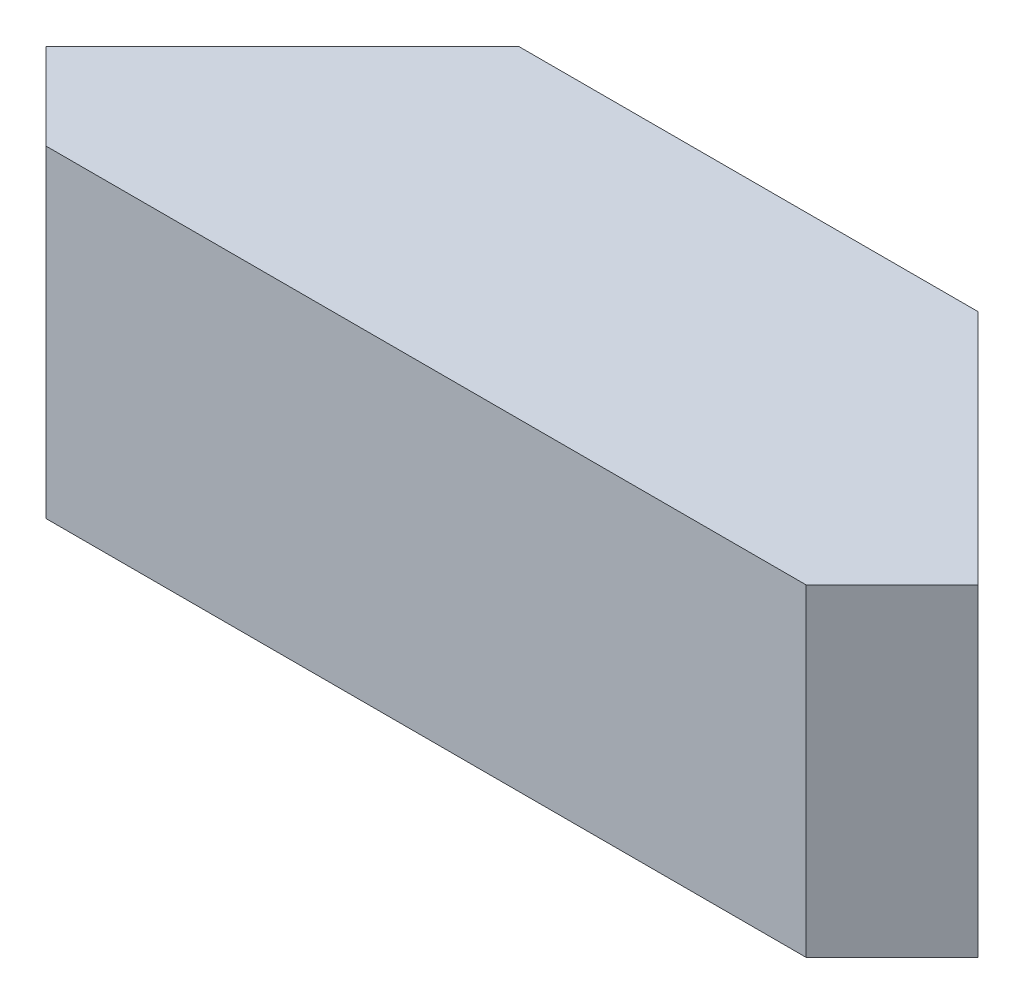
ISO-10303-21;
HEADER;
FILE_DESCRIPTION(('STEP AP214'),'2;1');
FILE_NAME('part.step','',(''),(''),'','','');
FILE_SCHEMA(('AUTOMOTIVE_DESIGN { 1 0 10303 214 1 1 1 1 }'));
ENDSEC;
DATA;
#1=APPLICATION_CONTEXT('core data for automotive mechanical design processes');
#2=APPLICATION_PROTOCOL_DEFINITION('international standard','automotive_design',2000,#1);
#3=PRODUCT_CONTEXT('',#1,'mechanical');
#4=PRODUCT('Part','Part','',(#3));
#5=PRODUCT_RELATED_PRODUCT_CATEGORY('part','',(#4));
#6=PRODUCT_DEFINITION_FORMATION('','',#4);
#7=PRODUCT_DEFINITION_CONTEXT('part definition',#1,'design');
#8=PRODUCT_DEFINITION('design','',#6,#7);
#9=PRODUCT_DEFINITION_SHAPE('','',#8);
#10=(LENGTH_UNIT() NAMED_UNIT(*) SI_UNIT(.MILLI.,.METRE.));
#11=(NAMED_UNIT(*) PLANE_ANGLE_UNIT() SI_UNIT($,.RADIAN.));
#12=(NAMED_UNIT(*) SI_UNIT($,.STERADIAN.) SOLID_ANGLE_UNIT());
#13=UNCERTAINTY_MEASURE_WITH_UNIT(LENGTH_MEASURE(1.E-05),#10,'distance_accuracy_value','');
#14=(GEOMETRIC_REPRESENTATION_CONTEXT(3) GLOBAL_UNCERTAINTY_ASSIGNED_CONTEXT((#13)) GLOBAL_UNIT_ASSIGNED_CONTEXT((#10,
#11,#12)) REPRESENTATION_CONTEXT('',''));
#15=CARTESIAN_POINT('',(0.,0.,0.));
#16=DIRECTION('',(0.,0.,1.));
#17=DIRECTION('',(1.,0.,0.));
#18=AXIS2_PLACEMENT_3D('',#15,#16,#17);
#19=CARTESIAN_POINT('',(-144.810430508962,-1.65099999999988,1.26999999999967));
#20=DIRECTION('',(0.,1.,0.));
#21=DIRECTION('',(0.,0.,-1.));
#22=AXIS2_PLACEMENT_3D('',#19,#20,#21);
#23=PLANE('',#22);
#24=DIRECTION('',(-0.707106781186542,0.,-0.707106781186553));
#25=VECTOR('',#24,1.);
#26=CARTESIAN_POINT('',(0.0508000000000609,-1.651,5.71500000000016));
#27=LINE('',#26,#25);
#28=CARTESIAN_POINT('',(-4.3941999999999,-1.651,1.27000000000013));
#29=VERTEX_POINT('',#28);
#30=CARTESIAN_POINT('',(-5.66419999999987,-1.65099999999994,2.37138394108563E-13));
#31=VERTEX_POINT('',#30);
#32=EDGE_CURVE('E169',#29,#31,#27,.T.);
#33=ORIENTED_EDGE('',*,*,#32,.T.);
#34=DIRECTION('',(-1.,0.,0.));
#35=VECTOR('',#34,1.);
#36=CARTESIAN_POINT('',(117.2718,-1.651,5.43278804359171E-13));
#37=LINE('',#36,#35);
#38=CARTESIAN_POINT('',(-13.7922,-1.65099999999997,3.30505012061617E-13));
#39=VERTEX_POINT('',#38);
#40=EDGE_CURVE('E128',#31,#39,#37,.T.);
#41=ORIENTED_EDGE('',*,*,#40,.T.);
#42=DIRECTION('',(-0.707106781186547,0.,0.707106781186548));
#43=VECTOR('',#42,1.);
#44=CARTESIAN_POINT('',(-13.7922,-1.651,1.05624175134626E-13));
#45=LINE('',#44,#43);
#46=CARTESIAN_POINT('',(-15.0622,-1.65099999999994,1.2700000000001));
#47=VERTEX_POINT('',#46);
#48=EDGE_CURVE('E154',#39,#47,#45,.T.);
#49=ORIENTED_EDGE('',*,*,#48,.T.);
#50=DIRECTION('',(-1.,0.,0.));
#51=VECTOR('',#50,1.);
#52=CARTESIAN_POINT('',(-144.810430508962,-1.651,1.26999999999967));
#53=LINE('',#52,#51);
#54=EDGE_CURVE('E11',#29,#47,#53,.T.);
#55=ORIENTED_EDGE('',*,*,#54,.F.);
#56=EDGE_LOOP('',(#33,#41,#49,#55));
#57=FACE_BOUND('',#56,.T.);
#58=ADVANCED_FACE('F17',(#57),#23,.T.);
#59=CARTESIAN_POINT('',(-144.810430508962,1.65100000000012,1.26999999999967));
#60=DIRECTION('',(0.,0.,-1.));
#61=DIRECTION('',(0.,-1.,0.));
#62=AXIS2_PLACEMENT_3D('',#59,#60,#61);
#63=PLANE('',#62);
#64=DIRECTION('',(0.,-1.,0.));
#65=VECTOR('',#64,1.);
#66=CARTESIAN_POINT('',(-4.39419999999988,2.8575,1.27000000000015));
#67=LINE('',#66,#65);
#68=CARTESIAN_POINT('',(-4.39419999999988,1.651,1.27000000000014));
#69=VERTEX_POINT('',#68);
#70=EDGE_CURVE('E166',#69,#29,#67,.T.);
#71=ORIENTED_EDGE('',*,*,#70,.T.);
#72=ORIENTED_EDGE('',*,*,#54,.T.);
#73=DIRECTION('',(0.,1.,0.));
#74=VECTOR('',#73,1.);
#75=CARTESIAN_POINT('',(-15.0622,2.8575,1.27000000000012));
#76=LINE('',#75,#74);
#77=CARTESIAN_POINT('',(-15.0622,1.651,1.27000000000012));
#78=VERTEX_POINT('',#77);
#79=EDGE_CURVE('E136',#47,#78,#76,.T.);
#80=ORIENTED_EDGE('',*,*,#79,.T.);
#81=DIRECTION('',(-1.,0.,0.));
#82=VECTOR('',#81,1.);
#83=CARTESIAN_POINT('',(-144.810430508962,1.65100000000012,1.27000000000014));
#84=LINE('',#83,#82);
#85=EDGE_CURVE('E25',#69,#78,#84,.T.);
#86=ORIENTED_EDGE('',*,*,#85,.F.);
#87=EDGE_LOOP('',(#71,#72,#80,#86));
#88=FACE_BOUND('',#87,.T.);
#89=ADVANCED_FACE('F287',(#88),#63,.T.);
#90=CARTESIAN_POINT('',(-144.810430508962,1.65100000000012,-3.26995375221628E-13));
#91=DIRECTION('',(0.,-1.,0.));
#92=DIRECTION('',(0.,0.,-1.));
#93=AXIS2_PLACEMENT_3D('',#90,#91,#92);
#94=PLANE('',#93);
#95=DIRECTION('',(0.707106781186542,0.,0.707106781186553));
#96=VECTOR('',#95,1.);
#97=CARTESIAN_POINT('',(0.0508000000000609,1.651,5.71500000000016));
#98=LINE('',#97,#96);
#99=CARTESIAN_POINT('',(-5.66419999999987,1.651,3.34510927402748E-13));
#100=VERTEX_POINT('',#99);
#101=EDGE_CURVE('E163',#100,#69,#98,.T.);
#102=ORIENTED_EDGE('',*,*,#101,.T.);
#103=ORIENTED_EDGE('',*,*,#85,.T.);
#104=DIRECTION('',(0.707106781186547,0.,-0.707106781186548));
#105=VECTOR('',#104,1.);
#106=CARTESIAN_POINT('',(-13.7922,1.651,1.08624856902051E-13));
#107=LINE('',#106,#105);
#108=CARTESIAN_POINT('',(-13.7922,1.651,2.18006246431196E-13));
#109=VERTEX_POINT('',#108);
#110=EDGE_CURVE('E131',#78,#109,#107,.T.);
#111=ORIENTED_EDGE('',*,*,#110,.T.);
#112=DIRECTION('',(1.,0.,0.));
#113=VECTOR('',#112,1.);
#114=CARTESIAN_POINT('',(117.2718,1.651,5.46290168880137E-13));
#115=LINE('',#114,#113);
#116=EDGE_CURVE('E38',#109,#100,#115,.T.);
#117=ORIENTED_EDGE('',*,*,#116,.T.);
#118=EDGE_LOOP('',(#102,#103,#111,#117));
#119=FACE_BOUND('',#118,.T.);
#120=ADVANCED_FACE('F132',(#119),#94,.T.);
#121=CARTESIAN_POINT('',(117.2718,-2.85750000000012,5.41667405373758E-13));
#122=DIRECTION('',(0.,0.,1.));
#123=DIRECTION('',(0.,-1.,0.));
#124=AXIS2_PLACEMENT_3D('',#121,#122,#123);
#125=PLANE('',#124);
#126=DIRECTION('',(0.,1.,0.));
#127=VECTOR('',#126,1.);
#128=CARTESIAN_POINT('',(-13.7922,2.8575,1.10160282101298E-13));
#129=LINE('',#128,#127);
#130=CARTESIAN_POINT('',(-13.7922,-2.8575,3.30116128664054E-13));
#131=VERTEX_POINT('',#130);
#132=EDGE_CURVE('E158',#131,#39,#129,.T.);
#133=ORIENTED_EDGE('',*,*,#132,.T.);
#134=ORIENTED_EDGE('',*,*,#40,.F.);
#135=DIRECTION('',(0.,-1.,0.));
#136=VECTOR('',#135,1.);
#137=CARTESIAN_POINT('',(-5.66419999999987,2.8575,1.31838984174237E-13));
#138=LINE('',#137,#136);
#139=CARTESIAN_POINT('',(-5.66419999999987,-2.85750000000004,2.33049256975759E-13));
#140=VERTEX_POINT('',#139);
#141=EDGE_CURVE('E162',#31,#140,#138,.T.);
#142=ORIENTED_EDGE('',*,*,#141,.T.);
#143=DIRECTION('',(-1.,0.,0.));
#144=VECTOR('',#143,1.);
#145=CARTESIAN_POINT('',(117.2718,-2.85750000000012,1.32272665043231E-13));
#146=LINE('',#145,#144);
#147=EDGE_CURVE('E444',#140,#131,#146,.T.);
#148=ORIENTED_EDGE('',*,*,#147,.T.);
#149=EDGE_LOOP('',(#133,#134,#142,#148));
#150=FACE_BOUND('',#149,.T.);
#151=ADVANCED_FACE('F231',(#150),#125,.F.);
#152=CARTESIAN_POINT('',(117.2718,2.85749999999988,5.46871575801688E-13));
#153=DIRECTION('',(0.,0.,1.));
#154=DIRECTION('',(0.,-1.,0.));
#155=AXIS2_PLACEMENT_3D('',#152,#153,#154);
#156=PLANE('',#155);
#157=DIRECTION('',(0.,1.,0.));
#158=VECTOR('',#157,1.);
#159=CARTESIAN_POINT('',(-13.7922,2.8575,1.08847797727046E-13));
#160=LINE('',#159,#158);
#161=CARTESIAN_POINT('',(-13.7922,2.8575,3.22657422708468E-13));
#162=VERTEX_POINT('',#161);
#163=EDGE_CURVE('E123',#109,#162,#160,.T.);
#164=ORIENTED_EDGE('',*,*,#163,.T.);
#165=DIRECTION('',(1.,0.,0.));
#166=VECTOR('',#165,1.);
#167=CARTESIAN_POINT('',(117.2718,2.85749999999988,1.09721259855533E-13));
#168=LINE('',#167,#166);
#169=CARTESIAN_POINT('',(-5.66419999999987,2.8575,3.35994253253258E-13));
#170=VERTEX_POINT('',#169);
#171=EDGE_CURVE('E460',#162,#170,#168,.T.);
#172=ORIENTED_EDGE('',*,*,#171,.T.);
#173=DIRECTION('',(0.,-1.,0.));
#174=VECTOR('',#173,1.);
#175=CARTESIAN_POINT('',(-5.66419999999986,2.8575,1.37043154602168E-13));
#176=LINE('',#175,#174);
#177=EDGE_CURVE('E125',#170,#100,#176,.T.);
#178=ORIENTED_EDGE('',*,*,#177,.T.);
#179=ORIENTED_EDGE('',*,*,#116,.F.);
#180=EDGE_LOOP('',(#164,#172,#178,#179));
#181=FACE_BOUND('',#180,.T.);
#182=ADVANCED_FACE('F120',(#181),#156,.F.);
#183=CARTESIAN_POINT('',(0.0508000000000609,2.8575,5.71500000000016));
#184=DIRECTION('',(-0.707106781186553,0.,0.707106781186542));
#185=DIRECTION('',(0.,1.,0.));
#186=AXIS2_PLACEMENT_3D('',#183,#184,#185);
#187=PLANE('',#186);
#188=DIRECTION('',(0.,-1.,0.));
#189=VECTOR('',#188,1.);
#190=CARTESIAN_POINT('',(-1.47319999999993,2.8575,4.19100000000015));
#191=LINE('',#190,#189);
#192=CARTESIAN_POINT('',(-1.47319999999993,2.8575,4.19100000000015));
#193=VERTEX_POINT('',#192);
#194=CARTESIAN_POINT('',(-1.47319999999993,-2.85750000000004,4.19100000000015));
#195=VERTEX_POINT('',#194);
#196=EDGE_CURVE('E143',#193,#195,#191,.T.);
#197=ORIENTED_EDGE('',*,*,#196,.T.);
#198=DIRECTION('',(-0.707106781186542,0.,-0.707106781186553));
#199=VECTOR('',#198,1.);
#200=CARTESIAN_POINT('',(-1.47319999999992,-2.85750000000012,4.19100000000015));
#201=LINE('',#200,#199);
#202=EDGE_CURVE('E441',#195,#140,#201,.T.);
#203=ORIENTED_EDGE('',*,*,#202,.T.);
#204=ORIENTED_EDGE('',*,*,#141,.F.);
#205=ORIENTED_EDGE('',*,*,#32,.F.);
#206=ORIENTED_EDGE('',*,*,#70,.F.);
#207=ORIENTED_EDGE('',*,*,#101,.F.);
#208=ORIENTED_EDGE('',*,*,#177,.F.);
#209=DIRECTION('',(0.707106781186541,0.,0.707106781186555));
#210=VECTOR('',#209,1.);
#211=CARTESIAN_POINT('',(-5.66419999999987,2.8575,1.37476835471162E-13));
#212=LINE('',#211,#210);
#213=EDGE_CURVE('E457',#170,#193,#212,.T.);
#214=ORIENTED_EDGE('',*,*,#213,.T.);
#215=EDGE_LOOP('',(#197,#203,#204,#205,#206,#207,#208,#214));
#216=FACE_BOUND('',#215,.T.);
#217=ADVANCED_FACE('F230',(#216),#187,.F.);
#218=CARTESIAN_POINT('',(-13.7922,2.8575,1.09721259855533E-13));
#219=DIRECTION('',(0.707106781186548,0.,0.707106781186547));
#220=DIRECTION('',(0.,-1.,0.));
#221=AXIS2_PLACEMENT_3D('',#218,#219,#220);
#222=PLANE('',#221);
#223=DIRECTION('',(0.,1.,0.));
#224=VECTOR('',#223,1.);
#225=CARTESIAN_POINT('',(-17.9832,2.8575,4.19100000000007));
#226=LINE('',#225,#224);
#227=CARTESIAN_POINT('',(-17.9832,-2.8575,4.19100000000007));
#228=VERTEX_POINT('',#227);
#229=CARTESIAN_POINT('',(-17.9832,2.8575,4.19100000000007));
#230=VERTEX_POINT('',#229);
#231=EDGE_CURVE('E464',#228,#230,#226,.T.);
#232=ORIENTED_EDGE('',*,*,#231,.T.);
#233=DIRECTION('',(0.707106781186549,0.,-0.707106781186546));
#234=VECTOR('',#233,1.);
#235=CARTESIAN_POINT('',(-17.9832,2.8575,4.19100000000007));
#236=LINE('',#235,#234);
#237=EDGE_CURVE('E140',#230,#162,#236,.T.);
#238=ORIENTED_EDGE('',*,*,#237,.T.);
#239=ORIENTED_EDGE('',*,*,#163,.F.);
#240=ORIENTED_EDGE('',*,*,#110,.F.);
#241=ORIENTED_EDGE('',*,*,#79,.F.);
#242=ORIENTED_EDGE('',*,*,#48,.F.);
#243=ORIENTED_EDGE('',*,*,#132,.F.);
#244=DIRECTION('',(-0.707106781186549,0.,0.707106781186546));
#245=VECTOR('',#244,1.);
#246=CARTESIAN_POINT('',(-13.7922,-2.85750000000012,1.04517089427602E-13));
#247=LINE('',#246,#245);
#248=EDGE_CURVE('E465',#131,#228,#247,.T.);
#249=ORIENTED_EDGE('',*,*,#248,.T.);
#250=EDGE_LOOP('',(#232,#238,#239,#240,#241,#242,#243,#249));
#251=FACE_BOUND('',#250,.T.);
#252=ADVANCED_FACE('F138',(#251),#222,.F.);
#253=CARTESIAN_POINT('',(-1.47319999999993,2.8575,4.19100000000015));
#254=DIRECTION('',(-0.707106781186545,0.,-0.70710678118655));
#255=DIRECTION('',(-0.70710678118655,0.,0.707106781186545));
#256=AXIS2_PLACEMENT_3D('',#253,#254,#255);
#257=PLANE('',#256);
#258=ORIENTED_EDGE('',*,*,#196,.F.);
#259=DIRECTION('',(-0.707106781186548,0.,0.707106781186547));
#260=VECTOR('',#259,1.);
#261=CARTESIAN_POINT('',(-1.47319999999994,2.8575,4.19100000000015));
#262=LINE('',#261,#260);
#263=CARTESIAN_POINT('',(-2.99719999999994,2.8575,5.71500000000014));
#264=VERTEX_POINT('',#263);
#265=EDGE_CURVE('E461',#193,#264,#262,.T.);
#266=ORIENTED_EDGE('',*,*,#265,.T.);
#267=DIRECTION('',(0.,-1.,0.));
#268=VECTOR('',#267,1.);
#269=CARTESIAN_POINT('',(-2.99719999999993,2.85749999999987,5.71500000000014));
#270=LINE('',#269,#268);
#271=CARTESIAN_POINT('',(-2.99719999999993,-2.85750000000004,5.71500000000013));
#272=VERTEX_POINT('',#271);
#273=EDGE_CURVE('E483',#264,#272,#270,.T.);
#274=ORIENTED_EDGE('',*,*,#273,.T.);
#275=DIRECTION('',(0.707106781186555,0.,-0.70710678118654));
#276=VECTOR('',#275,1.);
#277=CARTESIAN_POINT('',(-2.99719999999995,-2.85750000000012,5.71500000000014));
#278=LINE('',#277,#276);
#279=EDGE_CURVE('E148',#272,#195,#278,.T.);
#280=ORIENTED_EDGE('',*,*,#279,.T.);
#281=EDGE_LOOP('',(#258,#266,#274,#280));
#282=FACE_BOUND('',#281,.T.);
#283=ADVANCED_FACE('F239',(#282),#257,.F.);
#284=CARTESIAN_POINT('',(117.2718,-2.85750000000012,5.41667405373758E-13));
#285=DIRECTION('',(0.,1.,0.));
#286=DIRECTION('',(0.,0.,-1.));
#287=AXIS2_PLACEMENT_3D('',#284,#285,#286);
#288=PLANE('',#287);
#289=DIRECTION('',(-0.707106781186544,0.,-0.707106781186551));
#290=VECTOR('',#289,1.);
#291=CARTESIAN_POINT('',(-17.9832,-2.8575,4.19100000000007));
#292=LINE('',#291,#290);
#293=CARTESIAN_POINT('',(-16.4592,-2.85750000000006,5.7150000000001));
#294=VERTEX_POINT('',#293);
#295=EDGE_CURVE('E467',#294,#228,#292,.T.);
#296=ORIENTED_EDGE('',*,*,#295,.T.);
#297=ORIENTED_EDGE('',*,*,#248,.F.);
#298=ORIENTED_EDGE('',*,*,#147,.F.);
#299=ORIENTED_EDGE('',*,*,#202,.F.);
#300=ORIENTED_EDGE('',*,*,#279,.F.);
#301=DIRECTION('',(-1.,0.,0.));
#302=VECTOR('',#301,1.);
#303=CARTESIAN_POINT('',(117.2718,-2.8575,5.71500000000054));
#304=LINE('',#303,#302);
#305=EDGE_CURVE('E486',#272,#294,#304,.T.);
#306=ORIENTED_EDGE('',*,*,#305,.T.);
#307=EDGE_LOOP('',(#296,#297,#298,#299,#300,#306));
#308=FACE_BOUND('',#307,.T.);
#309=ADVANCED_FACE('F209',(#308),#288,.F.);
#310=CARTESIAN_POINT('',(-17.9832,2.8575,4.19100000000007));
#311=DIRECTION('',(0.707106781186551,0.,-0.707106781186544));
#312=DIRECTION('',(0.,-1.,0.));
#313=AXIS2_PLACEMENT_3D('',#310,#311,#312);
#314=PLANE('',#313);
#315=DIRECTION('',(0.,1.,0.));
#316=VECTOR('',#315,1.);
#317=CARTESIAN_POINT('',(-16.4592,2.85749999999987,5.7150000000001));
#318=LINE('',#317,#316);
#319=CARTESIAN_POINT('',(-16.4592,2.8575,5.71500000000012));
#320=VERTEX_POINT('',#319);
#321=EDGE_CURVE('E497',#294,#320,#318,.T.);
#322=ORIENTED_EDGE('',*,*,#321,.T.);
#323=DIRECTION('',(-0.707106781186539,0.,-0.707106781186556));
#324=VECTOR('',#323,1.);
#325=CARTESIAN_POINT('',(-16.4592,2.8575,5.7150000000001));
#326=LINE('',#325,#324);
#327=EDGE_CURVE('E455',#320,#230,#326,.T.);
#328=ORIENTED_EDGE('',*,*,#327,.T.);
#329=ORIENTED_EDGE('',*,*,#231,.F.);
#330=ORIENTED_EDGE('',*,*,#295,.F.);
#331=EDGE_LOOP('',(#322,#328,#329,#330));
#332=FACE_BOUND('',#331,.T.);
#333=ADVANCED_FACE('F204',(#332),#314,.F.);
#334=CARTESIAN_POINT('',(117.2718,2.85749999999988,5.46871575801688E-13));
#335=DIRECTION('',(0.,-1.,0.));
#336=DIRECTION('',(0.,0.,-1.));
#337=AXIS2_PLACEMENT_3D('',#334,#335,#336);
#338=PLANE('',#337);
#339=ORIENTED_EDGE('',*,*,#327,.F.);
#340=DIRECTION('',(1.,0.,0.));
#341=VECTOR('',#340,1.);
#342=CARTESIAN_POINT('',(117.2718,2.8575,5.71500000000055));
#343=LINE('',#342,#341);
#344=EDGE_CURVE('E480',#320,#264,#343,.T.);
#345=ORIENTED_EDGE('',*,*,#344,.T.);
#346=ORIENTED_EDGE('',*,*,#265,.F.);
#347=ORIENTED_EDGE('',*,*,#213,.F.);
#348=ORIENTED_EDGE('',*,*,#171,.F.);
#349=ORIENTED_EDGE('',*,*,#237,.F.);
#350=EDGE_LOOP('',(#339,#345,#346,#347,#348,#349));
#351=FACE_BOUND('',#350,.T.);
#352=ADVANCED_FACE('F195',(#351),#338,.F.);
#353=CARTESIAN_POINT('',(117.2718,2.85749999999987,5.71500000000055));
#354=DIRECTION('',(0.,0.,-1.));
#355=DIRECTION('',(0.,-1.,0.));
#356=AXIS2_PLACEMENT_3D('',#353,#354,#355);
#357=PLANE('',#356);
#358=ORIENTED_EDGE('',*,*,#321,.F.);
#359=ORIENTED_EDGE('',*,*,#305,.F.);
#360=ORIENTED_EDGE('',*,*,#273,.F.);
#361=ORIENTED_EDGE('',*,*,#344,.F.);
#362=EDGE_LOOP('',(#358,#359,#360,#361));
#363=FACE_BOUND('',#362,.T.);
#364=ADVANCED_FACE('F190',(#363),#357,.F.);
#365=CLOSED_SHELL('',(#58,#89,#120,#151,#182,#217,#252,#283,#309,#333,#352,#364));
#366=MANIFOLD_SOLID_BREP('B1',#365);
#367=ADVANCED_BREP_SHAPE_REPRESENTATION('',(#18,#366),#14);
#368=SHAPE_DEFINITION_REPRESENTATION(#9,#367);
ENDSEC;
END-ISO-10303-21;
